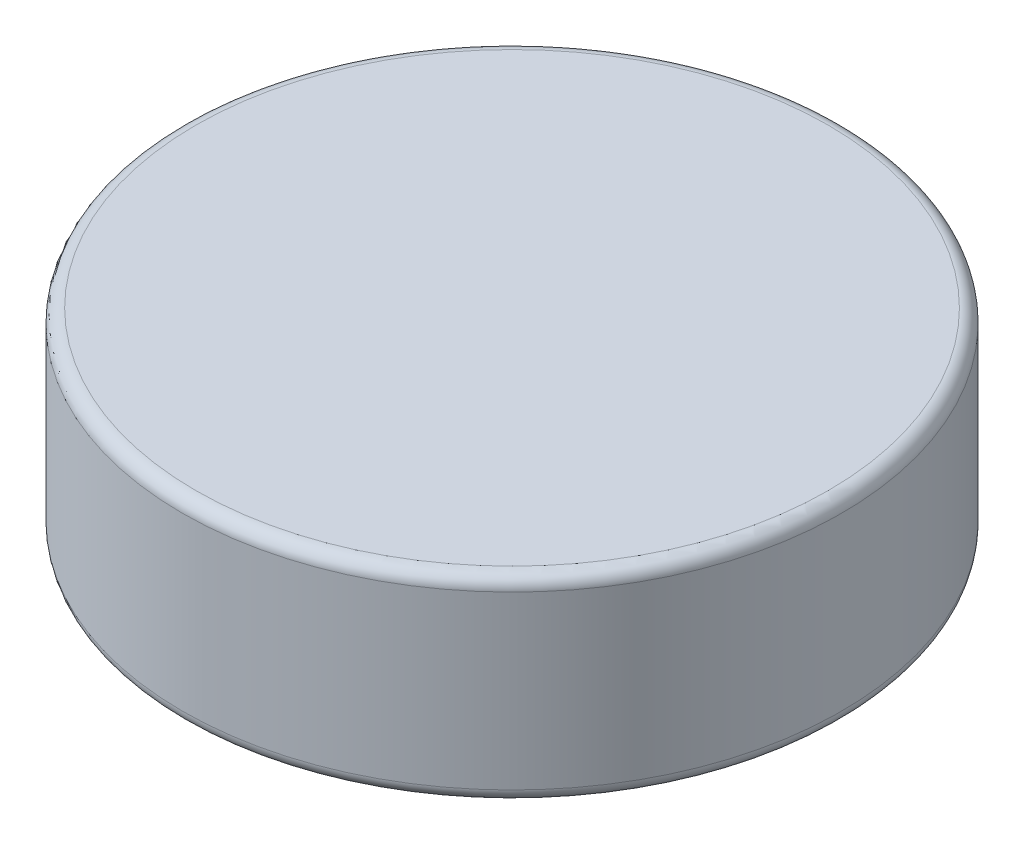
ISO-10303-21;
HEADER;
FILE_DESCRIPTION(('STEP AP214'),'2;1');
FILE_NAME('part.step','',(''),(''),'','','');
FILE_SCHEMA(('AUTOMOTIVE_DESIGN { 1 0 10303 214 1 1 1 1 }'));
ENDSEC;
DATA;
#1=APPLICATION_CONTEXT('core data for automotive mechanical design processes');
#2=APPLICATION_PROTOCOL_DEFINITION('international standard','automotive_design',2000,#1);
#3=PRODUCT_CONTEXT('',#1,'mechanical');
#4=PRODUCT('Part','Part','',(#3));
#5=PRODUCT_RELATED_PRODUCT_CATEGORY('part','',(#4));
#6=PRODUCT_DEFINITION_FORMATION('','',#4);
#7=PRODUCT_DEFINITION_CONTEXT('part definition',#1,'design');
#8=PRODUCT_DEFINITION('design','',#6,#7);
#9=PRODUCT_DEFINITION_SHAPE('','',#8);
#10=(LENGTH_UNIT() NAMED_UNIT(*) SI_UNIT(.MILLI.,.METRE.));
#11=(NAMED_UNIT(*) PLANE_ANGLE_UNIT() SI_UNIT($,.RADIAN.));
#12=(NAMED_UNIT(*) SI_UNIT($,.STERADIAN.) SOLID_ANGLE_UNIT());
#13=UNCERTAINTY_MEASURE_WITH_UNIT(LENGTH_MEASURE(1.E-05),#10,'distance_accuracy_value','');
#14=(GEOMETRIC_REPRESENTATION_CONTEXT(3) GLOBAL_UNCERTAINTY_ASSIGNED_CONTEXT((#13)) GLOBAL_UNIT_ASSIGNED_CONTEXT((#10,
#11,#12)) REPRESENTATION_CONTEXT('',''));
#15=CARTESIAN_POINT('',(0.,0.,0.));
#16=DIRECTION('',(0.,0.,1.));
#17=DIRECTION('',(1.,0.,0.));
#18=AXIS2_PLACEMENT_3D('',#15,#16,#17);
#19=CARTESIAN_POINT('',(0.,15.,0.));
#20=DIRECTION('',(0.,-1.,0.));
#21=DIRECTION('',(0.,0.,-1.));
#22=AXIS2_PLACEMENT_3D('',#19,#20,#21);
#23=CYLINDRICAL_SURFACE('',#22,50.);
#24=CARTESIAN_POINT('',(0.,-13.,0.));
#25=DIRECTION('',(0.,1.,0.));
#26=DIRECTION('',(0.,0.,1.));
#27=AXIS2_PLACEMENT_3D('',#24,#25,#26);
#28=CIRCLE('',#27,50.);
#29=CARTESIAN_POINT('',(0.,-13.,50.));
#30=VERTEX_POINT('',#29);
#31=EDGE_CURVE('E41',#30,#30,#28,.T.);
#32=ORIENTED_EDGE('',*,*,#31,.T.);
#33=EDGE_LOOP('',(#32));
#34=FACE_BOUND('',#33,.T.);
#35=CARTESIAN_POINT('',(0.,13.,0.));
#36=DIRECTION('',(0.,1.,0.));
#37=DIRECTION('',(0.,0.,1.));
#38=AXIS2_PLACEMENT_3D('',#35,#36,#37);
#39=CIRCLE('',#38,50.);
#40=CARTESIAN_POINT('',(0.,13.,50.));
#41=VERTEX_POINT('',#40);
#42=EDGE_CURVE('E45',#41,#41,#39,.F.);
#43=ORIENTED_EDGE('',*,*,#42,.T.);
#44=EDGE_LOOP('',(#43));
#45=FACE_BOUND('',#44,.T.);
#46=ADVANCED_FACE('F30',(#34,#45),#23,.T.);
#47=CARTESIAN_POINT('',(0.,15.,0.));
#48=DIRECTION('',(0.,1.,0.));
#49=DIRECTION('',(0.,0.,1.));
#50=AXIS2_PLACEMENT_3D('',#47,#48,#49);
#51=PLANE('',#50);
#52=CARTESIAN_POINT('',(0.,15.,0.));
#53=DIRECTION('',(0.,1.,0.));
#54=DIRECTION('',(0.,0.,1.));
#55=AXIS2_PLACEMENT_3D('',#52,#53,#54);
#56=CIRCLE('',#55,48.);
#57=CARTESIAN_POINT('',(0.,15.,48.));
#58=VERTEX_POINT('',#57);
#59=EDGE_CURVE('E10',#58,#58,#56,.T.);
#60=ORIENTED_EDGE('',*,*,#59,.T.);
#61=EDGE_LOOP('',(#60));
#62=FACE_BOUND('',#61,.T.);
#63=ADVANCED_FACE('F61',(#62),#51,.T.);
#64=CARTESIAN_POINT('',(0.,-15.,0.));
#65=DIRECTION('',(0.,1.,0.));
#66=DIRECTION('',(0.,0.,1.));
#67=AXIS2_PLACEMENT_3D('',#64,#65,#66);
#68=PLANE('',#67);
#69=CARTESIAN_POINT('',(0.,-15.,0.));
#70=DIRECTION('',(0.,1.,0.));
#71=DIRECTION('',(0.,0.,1.));
#72=AXIS2_PLACEMENT_3D('',#69,#70,#71);
#73=CIRCLE('',#72,48.);
#74=CARTESIAN_POINT('',(0.,-15.,48.));
#75=VERTEX_POINT('',#74);
#76=EDGE_CURVE('E37',#75,#75,#73,.F.);
#77=ORIENTED_EDGE('',*,*,#76,.T.);
#78=EDGE_LOOP('',(#77));
#79=FACE_BOUND('',#78,.T.);
#80=ADVANCED_FACE('F58',(#79),#68,.F.);
#81=CARTESIAN_POINT('',(0.,-13.,0.));
#82=DIRECTION('',(0.,1.,0.));
#83=DIRECTION('',(0.,0.,1.));
#84=AXIS2_PLACEMENT_3D('',#81,#82,#83);
#85=TOROIDAL_SURFACE('',#84,48.,2.);
#86=ORIENTED_EDGE('',*,*,#76,.F.);
#87=EDGE_LOOP('',(#86));
#88=FACE_BOUND('',#87,.T.);
#89=ORIENTED_EDGE('',*,*,#31,.F.);
#90=EDGE_LOOP('',(#89));
#91=FACE_BOUND('',#90,.T.);
#92=ADVANCED_FACE('F54',(#88,#91),#85,.T.);
#93=CARTESIAN_POINT('',(0.,13.,0.));
#94=DIRECTION('',(0.,1.,0.));
#95=DIRECTION('',(0.,0.,1.));
#96=AXIS2_PLACEMENT_3D('',#93,#94,#95);
#97=TOROIDAL_SURFACE('',#96,48.,2.);
#98=ORIENTED_EDGE('',*,*,#42,.F.);
#99=EDGE_LOOP('',(#98));
#100=FACE_BOUND('',#99,.T.);
#101=ORIENTED_EDGE('',*,*,#59,.F.);
#102=EDGE_LOOP('',(#101));
#103=FACE_BOUND('',#102,.T.);
#104=ADVANCED_FACE('F32',(#100,#103),#97,.T.);
#105=CLOSED_SHELL('',(#46,#63,#80,#92,#104));
#106=MANIFOLD_SOLID_BREP('B2',#105);
#107=ADVANCED_BREP_SHAPE_REPRESENTATION('',(#18,#106),#14);
#108=SHAPE_DEFINITION_REPRESENTATION(#9,#107);
ENDSEC;
END-ISO-10303-21;
